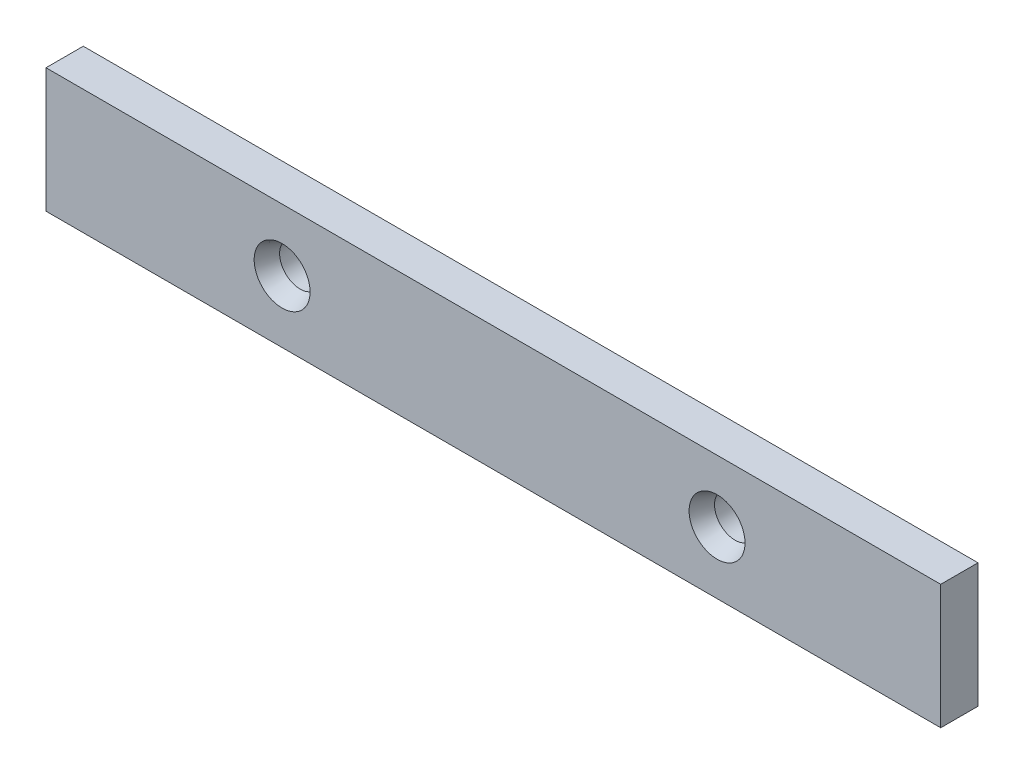
ISO-10303-21;
HEADER;
FILE_DESCRIPTION(('STEP AP214'),'2;1');
FILE_NAME('part.step','',(''),(''),'','','');
FILE_SCHEMA(('AUTOMOTIVE_DESIGN { 1 0 10303 214 1 1 1 1 }'));
ENDSEC;
DATA;
#1=APPLICATION_CONTEXT('core data for automotive mechanical design processes');
#2=APPLICATION_PROTOCOL_DEFINITION('international standard','automotive_design',2000,#1);
#3=PRODUCT_CONTEXT('',#1,'mechanical');
#4=PRODUCT('Part','Part','',(#3));
#5=PRODUCT_RELATED_PRODUCT_CATEGORY('part','',(#4));
#6=PRODUCT_DEFINITION_FORMATION('','',#4);
#7=PRODUCT_DEFINITION_CONTEXT('part definition',#1,'design');
#8=PRODUCT_DEFINITION('design','',#6,#7);
#9=PRODUCT_DEFINITION_SHAPE('','',#8);
#10=(LENGTH_UNIT() NAMED_UNIT(*) SI_UNIT(.MILLI.,.METRE.));
#11=(NAMED_UNIT(*) PLANE_ANGLE_UNIT() SI_UNIT($,.RADIAN.));
#12=(NAMED_UNIT(*) SI_UNIT($,.STERADIAN.) SOLID_ANGLE_UNIT());
#13=UNCERTAINTY_MEASURE_WITH_UNIT(LENGTH_MEASURE(1.E-05),#10,'distance_accuracy_value','');
#14=(GEOMETRIC_REPRESENTATION_CONTEXT(3) GLOBAL_UNCERTAINTY_ASSIGNED_CONTEXT((#13)) GLOBAL_UNIT_ASSIGNED_CONTEXT((#10,
#11,#12)) REPRESENTATION_CONTEXT('',''));
#15=CARTESIAN_POINT('',(0.,0.,0.));
#16=DIRECTION('',(0.,0.,1.));
#17=DIRECTION('',(1.,0.,0.));
#18=AXIS2_PLACEMENT_3D('',#15,#16,#17);
#19=CARTESIAN_POINT('',(0.,0.,6.));
#20=DIRECTION('',(1.,0.,0.));
#21=DIRECTION('',(0.,0.,-1.));
#22=AXIS2_PLACEMENT_3D('',#19,#20,#21);
#23=PLANE('',#22);
#24=DIRECTION('',(0.,-1.,0.));
#25=VECTOR('',#24,1.);
#26=CARTESIAN_POINT('',(0.,0.,0.));
#27=LINE('',#26,#25);
#28=CARTESIAN_POINT('',(0.,20.,0.));
#29=VERTEX_POINT('',#28);
#30=CARTESIAN_POINT('',(0.,0.,0.));
#31=VERTEX_POINT('',#30);
#32=EDGE_CURVE('E97',#29,#31,#27,.T.);
#33=ORIENTED_EDGE('',*,*,#32,.T.);
#34=DIRECTION('',(0.,0.,-1.));
#35=VECTOR('',#34,1.);
#36=CARTESIAN_POINT('',(0.,0.,6.));
#37=LINE('',#36,#35);
#38=CARTESIAN_POINT('',(0.,0.,6.));
#39=VERTEX_POINT('',#38);
#40=EDGE_CURVE('E11',#39,#31,#37,.T.);
#41=ORIENTED_EDGE('',*,*,#40,.F.);
#42=DIRECTION('',(0.,-1.,0.));
#43=VECTOR('',#42,1.);
#44=CARTESIAN_POINT('',(0.,0.,6.));
#45=LINE('',#44,#43);
#46=CARTESIAN_POINT('',(0.,20.,6.));
#47=VERTEX_POINT('',#46);
#48=EDGE_CURVE('E85',#47,#39,#45,.T.);
#49=ORIENTED_EDGE('',*,*,#48,.F.);
#50=DIRECTION('',(0.,0.,-1.));
#51=VECTOR('',#50,1.);
#52=CARTESIAN_POINT('',(0.,20.,6.));
#53=LINE('',#52,#51);
#54=EDGE_CURVE('E93',#47,#29,#53,.T.);
#55=ORIENTED_EDGE('',*,*,#54,.T.);
#56=EDGE_LOOP('',(#33,#41,#49,#55));
#57=FACE_BOUND('',#56,.T.);
#58=ADVANCED_FACE('F34',(#57),#23,.F.);
#59=CARTESIAN_POINT('',(0.,0.,6.));
#60=DIRECTION('',(0.,1.,0.));
#61=DIRECTION('',(0.,0.,1.));
#62=AXIS2_PLACEMENT_3D('',#59,#60,#61);
#63=PLANE('',#62);
#64=DIRECTION('',(1.,0.,0.));
#65=VECTOR('',#64,1.);
#66=CARTESIAN_POINT('',(0.,0.,0.));
#67=LINE('',#66,#65);
#68=CARTESIAN_POINT('',(144.,0.,0.));
#69=VERTEX_POINT('',#68);
#70=EDGE_CURVE('E89',#31,#69,#67,.T.);
#71=ORIENTED_EDGE('',*,*,#70,.T.);
#72=DIRECTION('',(0.,0.,-1.));
#73=VECTOR('',#72,1.);
#74=CARTESIAN_POINT('',(144.,0.,6.));
#75=LINE('',#74,#73);
#76=CARTESIAN_POINT('',(144.,0.,6.));
#77=VERTEX_POINT('',#76);
#78=EDGE_CURVE('E42',#77,#69,#75,.T.);
#79=ORIENTED_EDGE('',*,*,#78,.F.);
#80=DIRECTION('',(1.,0.,0.));
#81=VECTOR('',#80,1.);
#82=CARTESIAN_POINT('',(0.,0.,6.));
#83=LINE('',#82,#81);
#84=EDGE_CURVE('E80',#39,#77,#83,.T.);
#85=ORIENTED_EDGE('',*,*,#84,.F.);
#86=ORIENTED_EDGE('',*,*,#40,.T.);
#87=EDGE_LOOP('',(#71,#79,#85,#86));
#88=FACE_BOUND('',#87,.T.);
#89=ADVANCED_FACE('F88',(#88),#63,.F.);
#90=CARTESIAN_POINT('',(144.,0.,6.));
#91=DIRECTION('',(-1.,0.,0.));
#92=DIRECTION('',(0.,0.,1.));
#93=AXIS2_PLACEMENT_3D('',#90,#91,#92);
#94=PLANE('',#93);
#95=DIRECTION('',(0.,1.,0.));
#96=VECTOR('',#95,1.);
#97=CARTESIAN_POINT('',(144.,0.,0.));
#98=LINE('',#97,#96);
#99=CARTESIAN_POINT('',(144.,20.,0.));
#100=VERTEX_POINT('',#99);
#101=EDGE_CURVE('E67',#69,#100,#98,.T.);
#102=ORIENTED_EDGE('',*,*,#101,.T.);
#103=DIRECTION('',(0.,0.,-1.));
#104=VECTOR('',#103,1.);
#105=CARTESIAN_POINT('',(144.,20.,6.));
#106=LINE('',#105,#104);
#107=CARTESIAN_POINT('',(144.,20.,6.));
#108=VERTEX_POINT('',#107);
#109=EDGE_CURVE('E90',#108,#100,#106,.T.);
#110=ORIENTED_EDGE('',*,*,#109,.F.);
#111=DIRECTION('',(0.,1.,0.));
#112=VECTOR('',#111,1.);
#113=CARTESIAN_POINT('',(144.,0.,6.));
#114=LINE('',#113,#112);
#115=EDGE_CURVE('E83',#77,#108,#114,.T.);
#116=ORIENTED_EDGE('',*,*,#115,.F.);
#117=ORIENTED_EDGE('',*,*,#78,.T.);
#118=EDGE_LOOP('',(#102,#110,#116,#117));
#119=FACE_BOUND('',#118,.T.);
#120=ADVANCED_FACE('F91',(#119),#94,.F.);
#121=CARTESIAN_POINT('',(0.,20.,6.));
#122=DIRECTION('',(0.,-1.,0.));
#123=DIRECTION('',(0.,0.,-1.));
#124=AXIS2_PLACEMENT_3D('',#121,#122,#123);
#125=PLANE('',#124);
#126=DIRECTION('',(-1.,0.,0.));
#127=VECTOR('',#126,1.);
#128=CARTESIAN_POINT('',(0.,20.,0.));
#129=LINE('',#128,#127);
#130=EDGE_CURVE('E73',#100,#29,#129,.T.);
#131=ORIENTED_EDGE('',*,*,#130,.T.);
#132=ORIENTED_EDGE('',*,*,#54,.F.);
#133=DIRECTION('',(-1.,0.,0.));
#134=VECTOR('',#133,1.);
#135=CARTESIAN_POINT('',(0.,20.,6.));
#136=LINE('',#135,#134);
#137=EDGE_CURVE('E50',#108,#47,#136,.T.);
#138=ORIENTED_EDGE('',*,*,#137,.F.);
#139=ORIENTED_EDGE('',*,*,#109,.T.);
#140=EDGE_LOOP('',(#131,#132,#138,#139));
#141=FACE_BOUND('',#140,.T.);
#142=ADVANCED_FACE('F105',(#141),#125,.F.);
#143=CARTESIAN_POINT('',(0.,20.,6.));
#144=DIRECTION('',(0.,0.,-1.));
#145=DIRECTION('',(-1.,0.,0.));
#146=AXIS2_PLACEMENT_3D('',#143,#144,#145);
#147=PLANE('',#146);
#148=CARTESIAN_POINT('',(38.,10.,6.));
#149=DIRECTION('',(0.,0.,1.));
#150=DIRECTION('',(1.,0.,0.));
#151=AXIS2_PLACEMENT_3D('',#148,#149,#150);
#152=CIRCLE('',#151,4.5);
#153=CARTESIAN_POINT('',(42.5,10.,6.));
#154=VERTEX_POINT('',#153);
#155=EDGE_CURVE('E125',#154,#154,#152,.T.);
#156=ORIENTED_EDGE('',*,*,#155,.F.);
#157=EDGE_LOOP('',(#156));
#158=FACE_BOUND('',#157,.T.);
#159=CARTESIAN_POINT('',(108.,10.,6.));
#160=DIRECTION('',(0.,0.,1.));
#161=DIRECTION('',(1.,0.,0.));
#162=AXIS2_PLACEMENT_3D('',#159,#160,#161);
#163=CIRCLE('',#162,4.5);
#164=CARTESIAN_POINT('',(112.5,10.,6.));
#165=VERTEX_POINT('',#164);
#166=EDGE_CURVE('E116',#165,#165,#163,.T.);
#167=ORIENTED_EDGE('',*,*,#166,.F.);
#168=EDGE_LOOP('',(#167));
#169=FACE_BOUND('',#168,.T.);
#170=ORIENTED_EDGE('',*,*,#48,.T.);
#171=ORIENTED_EDGE('',*,*,#84,.T.);
#172=ORIENTED_EDGE('',*,*,#115,.T.);
#173=ORIENTED_EDGE('',*,*,#137,.T.);
#174=EDGE_LOOP('',(#170,#171,#172,#173));
#175=FACE_BOUND('',#174,.T.);
#176=ADVANCED_FACE('F81',(#158,#169,#175),#147,.F.);
#177=CARTESIAN_POINT('',(0.,20.,0.));
#178=DIRECTION('',(0.,0.,-1.));
#179=DIRECTION('',(-1.,0.,0.));
#180=AXIS2_PLACEMENT_3D('',#177,#178,#179);
#181=PLANE('',#180);
#182=CARTESIAN_POINT('',(38.,10.,0.));
#183=DIRECTION('',(0.,0.,1.));
#184=DIRECTION('',(1.,0.,0.));
#185=AXIS2_PLACEMENT_3D('',#182,#183,#184);
#186=CIRCLE('',#185,3.3);
#187=CARTESIAN_POINT('',(41.3,10.,0.));
#188=VERTEX_POINT('',#187);
#189=EDGE_CURVE('E119',#188,#188,#186,.T.);
#190=ORIENTED_EDGE('',*,*,#189,.T.);
#191=EDGE_LOOP('',(#190));
#192=FACE_BOUND('',#191,.T.);
#193=CARTESIAN_POINT('',(108.,10.,0.));
#194=DIRECTION('',(0.,0.,1.));
#195=DIRECTION('',(1.,0.,0.));
#196=AXIS2_PLACEMENT_3D('',#193,#194,#195);
#197=CIRCLE('',#196,3.3);
#198=CARTESIAN_POINT('',(111.3,10.,0.));
#199=VERTEX_POINT('',#198);
#200=EDGE_CURVE('E100',#199,#199,#197,.T.);
#201=ORIENTED_EDGE('',*,*,#200,.T.);
#202=EDGE_LOOP('',(#201));
#203=FACE_BOUND('',#202,.T.);
#204=ORIENTED_EDGE('',*,*,#32,.F.);
#205=ORIENTED_EDGE('',*,*,#130,.F.);
#206=ORIENTED_EDGE('',*,*,#101,.F.);
#207=ORIENTED_EDGE('',*,*,#70,.F.);
#208=EDGE_LOOP('',(#204,#205,#206,#207));
#209=FACE_BOUND('',#208,.T.);
#210=ADVANCED_FACE('F108',(#192,#203,#209),#181,.T.);
#211=CARTESIAN_POINT('',(108.,10.,6.));
#212=DIRECTION('',(0.,0.,1.));
#213=DIRECTION('',(1.,0.,0.));
#214=AXIS2_PLACEMENT_3D('',#211,#212,#213);
#215=CYLINDRICAL_SURFACE('',#214,3.3);
#216=ORIENTED_EDGE('',*,*,#200,.F.);
#217=EDGE_LOOP('',(#216));
#218=FACE_BOUND('',#217,.T.);
#219=CARTESIAN_POINT('',(108.,10.,3.10294372515228));
#220=DIRECTION('',(0.,0.,1.));
#221=DIRECTION('',(1.,0.,0.));
#222=AXIS2_PLACEMENT_3D('',#219,#220,#221);
#223=CIRCLE('',#222,3.3);
#224=CARTESIAN_POINT('',(111.3,10.,3.10294372515228));
#225=VERTEX_POINT('',#224);
#226=EDGE_CURVE('E113',#225,#225,#223,.T.);
#227=ORIENTED_EDGE('',*,*,#226,.T.);
#228=EDGE_LOOP('',(#227));
#229=FACE_BOUND('',#228,.T.);
#230=ADVANCED_FACE('F139',(#218,#229),#215,.F.);
#231=CARTESIAN_POINT('',(108.,10.,6.));
#232=DIRECTION('',(0.,0.,1.));
#233=DIRECTION('',(1.,0.,0.));
#234=AXIS2_PLACEMENT_3D('',#231,#232,#233);
#235=CONICAL_SURFACE('',#234,4.5,0.392699081698725);
#236=ORIENTED_EDGE('',*,*,#226,.F.);
#237=EDGE_LOOP('',(#236));
#238=FACE_BOUND('',#237,.T.);
#239=ORIENTED_EDGE('',*,*,#166,.T.);
#240=EDGE_LOOP('',(#239));
#241=FACE_BOUND('',#240,.T.);
#242=ADVANCED_FACE('F136',(#238,#241),#235,.F.);
#243=CARTESIAN_POINT('',(38.,10.,6.));
#244=DIRECTION('',(0.,0.,1.));
#245=DIRECTION('',(1.,0.,0.));
#246=AXIS2_PLACEMENT_3D('',#243,#244,#245);
#247=CYLINDRICAL_SURFACE('',#246,3.3);
#248=ORIENTED_EDGE('',*,*,#189,.F.);
#249=EDGE_LOOP('',(#248));
#250=FACE_BOUND('',#249,.T.);
#251=CARTESIAN_POINT('',(38.,10.,3.10294372515228));
#252=DIRECTION('',(0.,0.,1.));
#253=DIRECTION('',(1.,0.,0.));
#254=AXIS2_PLACEMENT_3D('',#251,#252,#253);
#255=CIRCLE('',#254,3.3);
#256=CARTESIAN_POINT('',(41.3,10.,3.10294372515228));
#257=VERTEX_POINT('',#256);
#258=EDGE_CURVE('E122',#257,#257,#255,.T.);
#259=ORIENTED_EDGE('',*,*,#258,.T.);
#260=EDGE_LOOP('',(#259));
#261=FACE_BOUND('',#260,.T.);
#262=ADVANCED_FACE('F138',(#250,#261),#247,.F.);
#263=CARTESIAN_POINT('',(38.,10.,6.));
#264=DIRECTION('',(0.,0.,1.));
#265=DIRECTION('',(1.,0.,0.));
#266=AXIS2_PLACEMENT_3D('',#263,#264,#265);
#267=CONICAL_SURFACE('',#266,4.5,0.392699081698725);
#268=ORIENTED_EDGE('',*,*,#258,.F.);
#269=EDGE_LOOP('',(#268));
#270=FACE_BOUND('',#269,.T.);
#271=ORIENTED_EDGE('',*,*,#155,.T.);
#272=EDGE_LOOP('',(#271));
#273=FACE_BOUND('',#272,.T.);
#274=ADVANCED_FACE('F129',(#270,#273),#267,.F.);
#275=CLOSED_SHELL('',(#58,#89,#120,#142,#176,#210,#230,#242,#262,#274));
#276=MANIFOLD_SOLID_BREP('B2',#275);
#277=ADVANCED_BREP_SHAPE_REPRESENTATION('',(#18,#276),#14);
#278=SHAPE_DEFINITION_REPRESENTATION(#9,#277);
ENDSEC;
END-ISO-10303-21;
